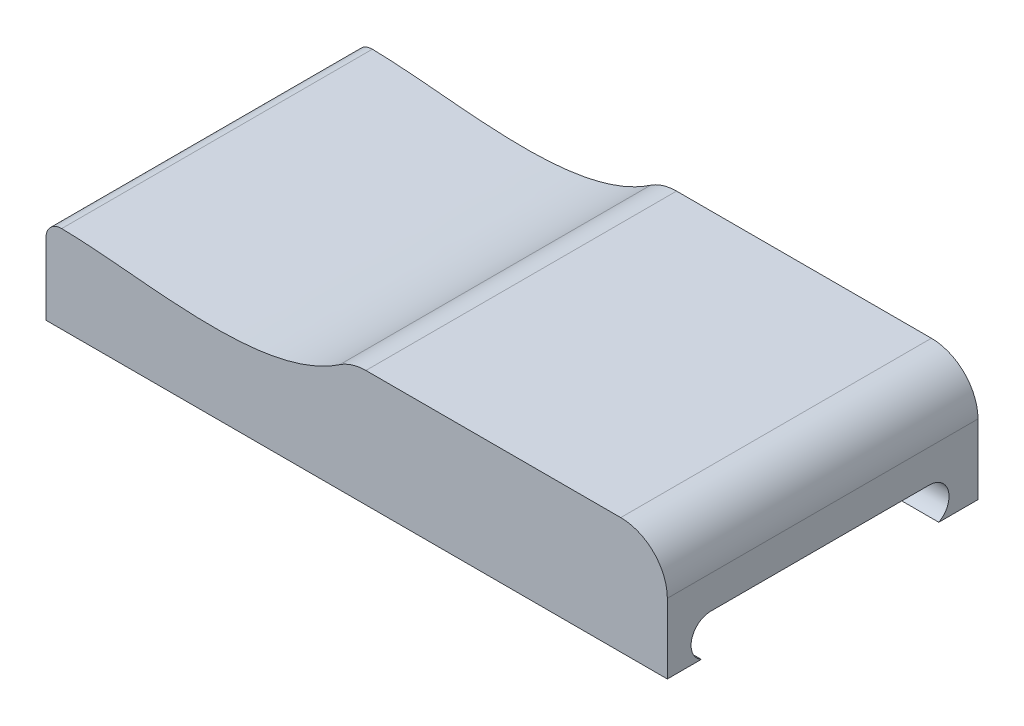
ISO-10303-21;
HEADER;
FILE_DESCRIPTION(('STEP AP214'),'2;1');
FILE_NAME('part.step','',(''),(''),'','','');
FILE_SCHEMA(('AUTOMOTIVE_DESIGN { 1 0 10303 214 1 1 1 1 }'));
ENDSEC;
DATA;
#1=APPLICATION_CONTEXT('core data for automotive mechanical design processes');
#2=APPLICATION_PROTOCOL_DEFINITION('international standard','automotive_design',2000,#1);
#3=PRODUCT_CONTEXT('',#1,'mechanical');
#4=PRODUCT('Part','Part','',(#3));
#5=PRODUCT_RELATED_PRODUCT_CATEGORY('part','',(#4));
#6=PRODUCT_DEFINITION_FORMATION('','',#4);
#7=PRODUCT_DEFINITION_CONTEXT('part definition',#1,'design');
#8=PRODUCT_DEFINITION('design','',#6,#7);
#9=PRODUCT_DEFINITION_SHAPE('','',#8);
#10=(LENGTH_UNIT() NAMED_UNIT(*) SI_UNIT(.MILLI.,.METRE.));
#11=(NAMED_UNIT(*) PLANE_ANGLE_UNIT() SI_UNIT($,.RADIAN.));
#12=(NAMED_UNIT(*) SI_UNIT($,.STERADIAN.) SOLID_ANGLE_UNIT());
#13=UNCERTAINTY_MEASURE_WITH_UNIT(LENGTH_MEASURE(1.E-05),#10,'distance_accuracy_value','');
#14=(GEOMETRIC_REPRESENTATION_CONTEXT(3) GLOBAL_UNCERTAINTY_ASSIGNED_CONTEXT((#13)) GLOBAL_UNIT_ASSIGNED_CONTEXT((#10,
#11,#12)) REPRESENTATION_CONTEXT('',''));
#15=CARTESIAN_POINT('',(0.,0.,0.));
#16=DIRECTION('',(0.,0.,1.));
#17=DIRECTION('',(1.,0.,0.));
#18=AXIS2_PLACEMENT_3D('',#15,#16,#17);
#19=CARTESIAN_POINT('',(-200.,60.,100.));
#20=DIRECTION('',(-1.,0.,0.));
#21=DIRECTION('',(0.,0.,1.));
#22=AXIS2_PLACEMENT_3D('',#19,#20,#21);
#23=PLANE('',#22);
#24=CARTESIAN_POINT('',(-200.,-3.87011120885277,-68.6456549981143));
#25=DIRECTION('',(-1.,0.,0.));
#26=DIRECTION('',(0.,0.,1.));
#27=AXIS2_PLACEMENT_3D('',#24,#25,#26);
#28=CIRCLE('',#27,12.7);
#29=CARTESIAN_POINT('',(-200.,8.82988879114723,-68.6456549981143));
#30=VERTEX_POINT('',#29);
#31=CARTESIAN_POINT('',(-200.,-15.,-74.7624822391516));
#32=VERTEX_POINT('',#31);
#33=EDGE_CURVE('E144',#30,#32,#28,.T.);
#34=ORIENTED_EDGE('',*,*,#33,.F.);
#35=DIRECTION('',(0.,0.,1.));
#36=VECTOR('',#35,1.);
#37=CARTESIAN_POINT('',(-200.,8.82988879114722,0.));
#38=LINE('',#37,#36);
#39=CARTESIAN_POINT('',(-200.,8.82988879114722,71.9943450018857));
#40=VERTEX_POINT('',#39);
#41=EDGE_CURVE('E146',#30,#40,#38,.T.);
#42=ORIENTED_EDGE('',*,*,#41,.T.);
#43=CARTESIAN_POINT('',(-200.,-3.87011120885278,71.9943450018857));
#44=DIRECTION('',(-1.,0.,0.));
#45=DIRECTION('',(0.,0.,1.));
#46=AXIS2_PLACEMENT_3D('',#43,#44,#45);
#47=CIRCLE('',#46,12.7);
#48=CARTESIAN_POINT('',(-200.,-15.,78.1111722429229));
#49=VERTEX_POINT('',#48);
#50=EDGE_CURVE('E136',#40,#49,#47,.F.);
#51=ORIENTED_EDGE('',*,*,#50,.T.);
#52=DIRECTION('',(0.,0.,-1.));
#53=VECTOR('',#52,1.);
#54=CARTESIAN_POINT('',(-200.,-15.,100.));
#55=LINE('',#54,#53);
#56=CARTESIAN_POINT('',(-200.,-15.,100.));
#57=VERTEX_POINT('',#56);
#58=EDGE_CURVE('E161',#57,#49,#55,.T.);
#59=ORIENTED_EDGE('',*,*,#58,.F.);
#60=DIRECTION('',(0.,-1.,0.));
#61=VECTOR('',#60,1.);
#62=CARTESIAN_POINT('',(-200.,60.,100.));
#63=LINE('',#62,#61);
#64=CARTESIAN_POINT('',(-200.,31.1944479439063,100.));
#65=VERTEX_POINT('',#64);
#66=EDGE_CURVE('E248',#65,#57,#63,.T.);
#67=ORIENTED_EDGE('',*,*,#66,.F.);
#68=DIRECTION('',(0.,0.,-1.));
#69=VECTOR('',#68,1.);
#70=CARTESIAN_POINT('',(-200.,31.1944479439063,-100.));
#71=LINE('',#70,#69);
#72=CARTESIAN_POINT('',(-200.,31.1944479439063,-100.));
#73=VERTEX_POINT('',#72);
#74=EDGE_CURVE('E42',#65,#73,#71,.T.);
#75=ORIENTED_EDGE('',*,*,#74,.T.);
#76=DIRECTION('',(0.,-1.,0.));
#77=VECTOR('',#76,1.);
#78=CARTESIAN_POINT('',(-200.,60.,-100.));
#79=LINE('',#78,#77);
#80=CARTESIAN_POINT('',(-200.,-15.,-100.));
#81=VERTEX_POINT('',#80);
#82=EDGE_CURVE('E258',#73,#81,#79,.T.);
#83=ORIENTED_EDGE('',*,*,#82,.T.);
#84=EDGE_CURVE('E160',#32,#81,#55,.T.);
#85=ORIENTED_EDGE('',*,*,#84,.F.);
#86=EDGE_LOOP('',(#34,#42,#51,#59,#67,#75,#83,#85));
#87=FACE_BOUND('',#86,.T.);
#88=ADVANCED_FACE('F34',(#87),#23,.T.);
#89=CARTESIAN_POINT('',(200.,60.,100.));
#90=DIRECTION('',(-1.,0.,0.));
#91=DIRECTION('',(0.,0.,1.));
#92=AXIS2_PLACEMENT_3D('',#89,#90,#91);
#93=PLANE('',#92);
#94=DIRECTION('',(0.,0.,1.));
#95=VECTOR('',#94,1.);
#96=CARTESIAN_POINT('',(200.,8.82988879114722,0.));
#97=LINE('',#96,#95);
#98=CARTESIAN_POINT('',(200.,8.82988879114723,-68.6456549981143));
#99=VERTEX_POINT('',#98);
#100=CARTESIAN_POINT('',(200.,8.82988879114722,71.9943450018857));
#101=VERTEX_POINT('',#100);
#102=EDGE_CURVE('E123',#99,#101,#97,.T.);
#103=ORIENTED_EDGE('',*,*,#102,.F.);
#104=CARTESIAN_POINT('',(200.,-3.87011120885277,-68.6456549981143));
#105=DIRECTION('',(-1.,0.,0.));
#106=DIRECTION('',(0.,0.,1.));
#107=AXIS2_PLACEMENT_3D('',#104,#105,#106);
#108=CIRCLE('',#107,12.7);
#109=CARTESIAN_POINT('',(200.,-15.,-74.7624822391516));
#110=VERTEX_POINT('',#109);
#111=EDGE_CURVE('E132',#99,#110,#108,.T.);
#112=ORIENTED_EDGE('',*,*,#111,.T.);
#113=DIRECTION('',(0.,0.,1.));
#114=VECTOR('',#113,1.);
#115=CARTESIAN_POINT('',(200.,-15.,-100.));
#116=LINE('',#115,#114);
#117=CARTESIAN_POINT('',(200.,-15.,-100.));
#118=VERTEX_POINT('',#117);
#119=EDGE_CURVE('E167',#118,#110,#116,.T.);
#120=ORIENTED_EDGE('',*,*,#119,.F.);
#121=DIRECTION('',(0.,-1.,0.));
#122=VECTOR('',#121,1.);
#123=CARTESIAN_POINT('',(200.,60.,-100.));
#124=LINE('',#123,#122);
#125=CARTESIAN_POINT('',(200.,30.,-100.));
#126=VERTEX_POINT('',#125);
#127=EDGE_CURVE('E271',#126,#118,#124,.T.);
#128=ORIENTED_EDGE('',*,*,#127,.F.);
#129=DIRECTION('',(0.,0.,-1.));
#130=VECTOR('',#129,1.);
#131=CARTESIAN_POINT('',(200.,30.,100.));
#132=LINE('',#131,#130);
#133=CARTESIAN_POINT('',(200.,30.,100.));
#134=VERTEX_POINT('',#133);
#135=EDGE_CURVE('E229',#126,#134,#132,.F.);
#136=ORIENTED_EDGE('',*,*,#135,.T.);
#137=DIRECTION('',(0.,-1.,0.));
#138=VECTOR('',#137,1.);
#139=CARTESIAN_POINT('',(200.,60.,100.));
#140=LINE('',#139,#138);
#141=CARTESIAN_POINT('',(200.,-15.,100.));
#142=VERTEX_POINT('',#141);
#143=EDGE_CURVE('E252',#134,#142,#140,.T.);
#144=ORIENTED_EDGE('',*,*,#143,.T.);
#145=CARTESIAN_POINT('',(200.,-15.,78.111172242923));
#146=VERTEX_POINT('',#145);
#147=EDGE_CURVE('E143',#146,#142,#116,.T.);
#148=ORIENTED_EDGE('',*,*,#147,.F.);
#149=CARTESIAN_POINT('',(200.,-3.87011120885278,71.9943450018857));
#150=DIRECTION('',(-1.,0.,0.));
#151=DIRECTION('',(0.,0.,1.));
#152=AXIS2_PLACEMENT_3D('',#149,#150,#151);
#153=CIRCLE('',#152,12.7);
#154=EDGE_CURVE('E49',#101,#146,#153,.F.);
#155=ORIENTED_EDGE('',*,*,#154,.F.);
#156=EDGE_LOOP('',(#103,#112,#120,#128,#136,#144,#148,#155));
#157=FACE_BOUND('',#156,.T.);
#158=ADVANCED_FACE('F141',(#157),#93,.F.);
#159=CARTESIAN_POINT('',(0.,-15.,0.));
#160=DIRECTION('',(0.,-1.,0.));
#161=DIRECTION('',(0.,0.,-1.));
#162=AXIS2_PLACEMENT_3D('',#159,#160,#161);
#163=PLANE('',#162);
#164=ORIENTED_EDGE('',*,*,#58,.T.);
#165=DIRECTION('',(-1.,0.,0.));
#166=VECTOR('',#165,1.);
#167=CARTESIAN_POINT('',(200.,-15.,78.1111722429229));
#168=LINE('',#167,#166);
#169=EDGE_CURVE('E138',#146,#49,#168,.T.);
#170=ORIENTED_EDGE('',*,*,#169,.F.);
#171=ORIENTED_EDGE('',*,*,#147,.T.);
#172=DIRECTION('',(-1.,0.,0.));
#173=VECTOR('',#172,1.);
#174=CARTESIAN_POINT('',(200.,-15.,100.));
#175=LINE('',#174,#173);
#176=EDGE_CURVE('E155',#142,#57,#175,.T.);
#177=ORIENTED_EDGE('',*,*,#176,.T.);
#178=EDGE_LOOP('',(#164,#170,#171,#177));
#179=FACE_BOUND('',#178,.T.);
#180=ADVANCED_FACE('F198',(#179),#163,.T.);
#181=CARTESIAN_POINT('',(-200.,60.,100.));
#182=DIRECTION('',(0.,0.,-1.));
#183=DIRECTION('',(-1.,0.,0.));
#184=AXIS2_PLACEMENT_3D('',#181,#182,#183);
#185=PLANE('',#184);
#186=CARTESIAN_POINT('',(-200.,41.0332841643842,100.));
#187=CARTESIAN_POINT('',(-145.162329497686,43.5654388195843,100.));
#188=CARTESIAN_POINT('',(-56.8269781144573,16.6614674130772,100.));
#189=CARTESIAN_POINT('',(-3.94704073671054,60.,100.));
#190=B_SPLINE_CURVE_WITH_KNOTS('',3,(#186,#187,#188,#189),.UNSPECIFIED.,.F.,.F.,(4,4),(0.,1.),.UNSPECIFIED.);
#191=CARTESIAN_POINT('',(-189.89568038354,41.1939037999827,100.));
#192=VERTEX_POINT('',#191);
#193=CARTESIAN_POINT('',(-10.8333811509343,54.8760659515193,100.));
#194=VERTEX_POINT('',#193);
#195=EDGE_CURVE('E170',#192,#194,#190,.T.);
#196=ORIENTED_EDGE('',*,*,#195,.F.);
#197=CARTESIAN_POINT('',(-190.,31.1944479439063,100.));
#198=DIRECTION('',(0.,0.,-1.));
#199=DIRECTION('',(-1.,0.,0.));
#200=AXIS2_PLACEMENT_3D('',#197,#198,#199);
#201=CIRCLE('',#200,10.);
#202=EDGE_CURVE('E245',#192,#65,#201,.F.);
#203=ORIENTED_EDGE('',*,*,#202,.T.);
#204=ORIENTED_EDGE('',*,*,#66,.T.);
#205=ORIENTED_EDGE('',*,*,#176,.F.);
#206=ORIENTED_EDGE('',*,*,#143,.F.);
#207=CARTESIAN_POINT('',(170.,30.,100.));
#208=DIRECTION('',(0.,0.,-1.));
#209=DIRECTION('',(-1.,0.,0.));
#210=AXIS2_PLACEMENT_3D('',#207,#208,#209);
#211=CIRCLE('',#210,30.);
#212=CARTESIAN_POINT('',(170.,60.,100.));
#213=VERTEX_POINT('',#212);
#214=EDGE_CURVE('E239',#134,#213,#211,.F.);
#215=ORIENTED_EDGE('',*,*,#214,.T.);
#216=DIRECTION('',(1.,0.,0.));
#217=VECTOR('',#216,1.);
#218=CARTESIAN_POINT('',(-200.,60.,100.));
#219=LINE('',#218,#217);
#220=CARTESIAN_POINT('',(5.935081592432,60.,100.));
#221=VERTEX_POINT('',#220);
#222=EDGE_CURVE('E260',#221,#213,#219,.T.);
#223=ORIENTED_EDGE('',*,*,#222,.F.);
#224=CARTESIAN_POINT('',(5.93508159243199,30.,100.));
#225=DIRECTION('',(0.,0.,-1.));
#226=DIRECTION('',(-1.,0.,0.));
#227=AXIS2_PLACEMENT_3D('',#224,#225,#226);
#228=CIRCLE('',#227,30.);
#229=EDGE_CURVE('E236',#221,#194,#228,.F.);
#230=ORIENTED_EDGE('',*,*,#229,.T.);
#231=EDGE_LOOP('',(#196,#203,#204,#205,#206,#215,#223,#230));
#232=FACE_BOUND('',#231,.T.);
#233=ADVANCED_FACE('F195',(#232),#185,.F.);
#234=CARTESIAN_POINT('',(-200.,60.,-100.));
#235=DIRECTION('',(0.,0.,-1.));
#236=DIRECTION('',(-1.,0.,0.));
#237=AXIS2_PLACEMENT_3D('',#234,#235,#236);
#238=PLANE('',#237);
#239=ORIENTED_EDGE('',*,*,#82,.F.);
#240=CARTESIAN_POINT('',(-190.,31.1944479439063,-100.));
#241=DIRECTION('',(0.,0.,-1.));
#242=DIRECTION('',(-1.,0.,0.));
#243=AXIS2_PLACEMENT_3D('',#240,#241,#242);
#244=CIRCLE('',#243,10.);
#245=CARTESIAN_POINT('',(-189.89568038354,41.1939037999827,-100.));
#246=VERTEX_POINT('',#245);
#247=EDGE_CURVE('E11',#73,#246,#244,.T.);
#248=ORIENTED_EDGE('',*,*,#247,.T.);
#249=CARTESIAN_POINT('',(-200.,41.0332841643842,-100.));
#250=CARTESIAN_POINT('',(-145.162329497686,43.5654388195843,-100.));
#251=CARTESIAN_POINT('',(-56.8269781144573,16.6614674130772,-100.));
#252=CARTESIAN_POINT('',(-3.94704073671054,60.,-100.));
#253=B_SPLINE_CURVE_WITH_KNOTS('',3,(#249,#250,#251,#252),.UNSPECIFIED.,.F.,.F.,(4,4),(0.,1.),.UNSPECIFIED.);
#254=CARTESIAN_POINT('',(-10.8333811509343,54.8760659515193,-100.));
#255=VERTEX_POINT('',#254);
#256=EDGE_CURVE('E256',#255,#246,#253,.F.);
#257=ORIENTED_EDGE('',*,*,#256,.F.);
#258=CARTESIAN_POINT('',(5.93508159243199,30.,-100.));
#259=DIRECTION('',(0.,0.,-1.));
#260=DIRECTION('',(-1.,0.,0.));
#261=AXIS2_PLACEMENT_3D('',#258,#259,#260);
#262=CIRCLE('',#261,30.);
#263=CARTESIAN_POINT('',(5.935081592432,60.,-100.));
#264=VERTEX_POINT('',#263);
#265=EDGE_CURVE('E219',#255,#264,#262,.T.);
#266=ORIENTED_EDGE('',*,*,#265,.T.);
#267=DIRECTION('',(1.,0.,0.));
#268=VECTOR('',#267,1.);
#269=CARTESIAN_POINT('',(-200.,60.,-100.));
#270=LINE('',#269,#268);
#271=CARTESIAN_POINT('',(170.,60.,-100.));
#272=VERTEX_POINT('',#271);
#273=EDGE_CURVE('E259',#264,#272,#270,.T.);
#274=ORIENTED_EDGE('',*,*,#273,.T.);
#275=CARTESIAN_POINT('',(170.,30.,-100.));
#276=DIRECTION('',(0.,0.,-1.));
#277=DIRECTION('',(-1.,0.,0.));
#278=AXIS2_PLACEMENT_3D('',#275,#276,#277);
#279=CIRCLE('',#278,30.);
#280=EDGE_CURVE('E226',#272,#126,#279,.T.);
#281=ORIENTED_EDGE('',*,*,#280,.T.);
#282=ORIENTED_EDGE('',*,*,#127,.T.);
#283=DIRECTION('',(1.,0.,0.));
#284=VECTOR('',#283,1.);
#285=CARTESIAN_POINT('',(-200.,-15.,-100.));
#286=LINE('',#285,#284);
#287=EDGE_CURVE('E164',#81,#118,#286,.T.);
#288=ORIENTED_EDGE('',*,*,#287,.F.);
#289=EDGE_LOOP('',(#239,#248,#257,#266,#274,#281,#282,#288));
#290=FACE_BOUND('',#289,.T.);
#291=ADVANCED_FACE('F193',(#290),#238,.T.);
#292=CARTESIAN_POINT('',(0.,60.,0.));
#293=DIRECTION('',(0.,-1.,0.));
#294=DIRECTION('',(0.,0.,-1.));
#295=AXIS2_PLACEMENT_3D('',#292,#293,#294);
#296=PLANE('',#295);
#297=ORIENTED_EDGE('',*,*,#222,.T.);
#298=DIRECTION('',(0.,0.,-1.));
#299=VECTOR('',#298,1.);
#300=CARTESIAN_POINT('',(170.,60.,0.));
#301=LINE('',#300,#299);
#302=EDGE_CURVE('E227',#213,#272,#301,.T.);
#303=ORIENTED_EDGE('',*,*,#302,.T.);
#304=ORIENTED_EDGE('',*,*,#273,.F.);
#305=DIRECTION('',(0.,0.,1.));
#306=VECTOR('',#305,1.);
#307=CARTESIAN_POINT('',(5.93508159243199,60.,0.));
#308=LINE('',#307,#306);
#309=EDGE_CURVE('E222',#264,#221,#308,.T.);
#310=ORIENTED_EDGE('',*,*,#309,.T.);
#311=EDGE_LOOP('',(#297,#303,#304,#310));
#312=FACE_BOUND('',#311,.T.);
#313=ADVANCED_FACE('F187',(#312),#296,.F.);
#314=CARTESIAN_POINT('',(-200.,41.0332841643842,-120.));
#315=CARTESIAN_POINT('',(-145.162329497686,43.5654388195843,-120.));
#316=CARTESIAN_POINT('',(-56.8269781144573,16.6614674130772,-120.));
#317=CARTESIAN_POINT('',(-3.94704073671054,60.,-120.));
#318=B_SPLINE_CURVE_WITH_KNOTS('',3,(#314,#315,#316,#317),.UNSPECIFIED.,.F.,.F.,(4,4),(0.,1.),.UNSPECIFIED.);
#319=DIRECTION('',(0.,0.,1.));
#320=VECTOR('',#319,1.);
#321=SURFACE_OF_LINEAR_EXTRUSION('',#318,#320);
#322=ORIENTED_EDGE('',*,*,#256,.T.);
#323=DIRECTION('',(0.,0.,1.));
#324=VECTOR('',#323,1.);
#325=CARTESIAN_POINT('',(-189.89568038354,41.1939037999827,-100.));
#326=LINE('',#325,#324);
#327=EDGE_CURVE('E242',#246,#192,#326,.T.);
#328=ORIENTED_EDGE('',*,*,#327,.T.);
#329=ORIENTED_EDGE('',*,*,#195,.T.);
#330=DIRECTION('',(0.,0.,1.));
#331=VECTOR('',#330,1.);
#332=CARTESIAN_POINT('',(-10.8333811509343,54.8760659515193,100.));
#333=LINE('',#332,#331);
#334=EDGE_CURVE('E220',#194,#255,#333,.F.);
#335=ORIENTED_EDGE('',*,*,#334,.T.);
#336=EDGE_LOOP('',(#322,#328,#329,#335));
#337=FACE_BOUND('',#336,.T.);
#338=ADVANCED_FACE('F182',(#337),#321,.F.);
#339=CARTESIAN_POINT('',(170.,30.,0.));
#340=DIRECTION('',(0.,0.,-1.));
#341=DIRECTION('',(-1.,0.,0.));
#342=AXIS2_PLACEMENT_3D('',#339,#340,#341);
#343=CYLINDRICAL_SURFACE('',#342,30.);
#344=ORIENTED_EDGE('',*,*,#214,.F.);
#345=ORIENTED_EDGE('',*,*,#135,.F.);
#346=ORIENTED_EDGE('',*,*,#280,.F.);
#347=ORIENTED_EDGE('',*,*,#302,.F.);
#348=EDGE_LOOP('',(#344,#345,#346,#347));
#349=FACE_BOUND('',#348,.T.);
#350=ADVANCED_FACE('F186',(#349),#343,.T.);
#351=CARTESIAN_POINT('',(5.93508159243199,30.,0.));
#352=DIRECTION('',(0.,0.,1.));
#353=DIRECTION('',(1.,0.,0.));
#354=AXIS2_PLACEMENT_3D('',#351,#352,#353);
#355=CYLINDRICAL_SURFACE('',#354,30.);
#356=ORIENTED_EDGE('',*,*,#265,.F.);
#357=ORIENTED_EDGE('',*,*,#334,.F.);
#358=ORIENTED_EDGE('',*,*,#229,.F.);
#359=ORIENTED_EDGE('',*,*,#309,.F.);
#360=EDGE_LOOP('',(#356,#357,#358,#359));
#361=FACE_BOUND('',#360,.T.);
#362=ADVANCED_FACE('F208',(#361),#355,.T.);
#363=CARTESIAN_POINT('',(-190.,31.1944479439063,0.));
#364=DIRECTION('',(0.,0.,1.));
#365=DIRECTION('',(1.,0.,0.));
#366=AXIS2_PLACEMENT_3D('',#363,#364,#365);
#367=CYLINDRICAL_SURFACE('',#366,10.);
#368=ORIENTED_EDGE('',*,*,#247,.F.);
#369=ORIENTED_EDGE('',*,*,#74,.F.);
#370=ORIENTED_EDGE('',*,*,#202,.F.);
#371=ORIENTED_EDGE('',*,*,#327,.F.);
#372=EDGE_LOOP('',(#368,#369,#370,#371));
#373=FACE_BOUND('',#372,.T.);
#374=ADVANCED_FACE('F36',(#373),#367,.T.);
#375=DIRECTION('',(-1.,0.,0.));
#376=VECTOR('',#375,1.);
#377=CARTESIAN_POINT('',(200.,-15.,-74.7624822391516));
#378=LINE('',#377,#376);
#379=EDGE_CURVE('E152',#110,#32,#378,.T.);
#380=ORIENTED_EDGE('',*,*,#379,.T.);
#381=ORIENTED_EDGE('',*,*,#84,.T.);
#382=ORIENTED_EDGE('',*,*,#287,.T.);
#383=ORIENTED_EDGE('',*,*,#119,.T.);
#384=EDGE_LOOP('',(#380,#381,#382,#383));
#385=FACE_BOUND('',#384,.T.);
#386=ADVANCED_FACE('F189',(#385),#163,.T.);
#387=CARTESIAN_POINT('',(200.,-3.87011120885277,-68.6456549981143));
#388=DIRECTION('',(-1.,0.,0.));
#389=DIRECTION('',(0.,0.,1.));
#390=AXIS2_PLACEMENT_3D('',#387,#388,#389);
#391=CYLINDRICAL_SURFACE('',#390,12.7);
#392=ORIENTED_EDGE('',*,*,#33,.T.);
#393=ORIENTED_EDGE('',*,*,#379,.F.);
#394=ORIENTED_EDGE('',*,*,#111,.F.);
#395=DIRECTION('',(-1.,0.,0.));
#396=VECTOR('',#395,1.);
#397=CARTESIAN_POINT('',(200.,8.82988879114723,-68.6456549981143));
#398=LINE('',#397,#396);
#399=EDGE_CURVE('E128',#99,#30,#398,.T.);
#400=ORIENTED_EDGE('',*,*,#399,.T.);
#401=EDGE_LOOP('',(#392,#393,#394,#400));
#402=FACE_BOUND('',#401,.T.);
#403=ADVANCED_FACE('F283',(#402),#391,.F.);
#404=CARTESIAN_POINT('',(200.,8.82988879114722,0.));
#405=DIRECTION('',(0.,-1.,0.));
#406=DIRECTION('',(0.,0.,-1.));
#407=AXIS2_PLACEMENT_3D('',#404,#405,#406);
#408=PLANE('',#407);
#409=ORIENTED_EDGE('',*,*,#41,.F.);
#410=ORIENTED_EDGE('',*,*,#399,.F.);
#411=ORIENTED_EDGE('',*,*,#102,.T.);
#412=DIRECTION('',(-1.,0.,0.));
#413=VECTOR('',#412,1.);
#414=CARTESIAN_POINT('',(200.,8.82988879114722,71.9943450018857));
#415=LINE('',#414,#413);
#416=EDGE_CURVE('E126',#101,#40,#415,.T.);
#417=ORIENTED_EDGE('',*,*,#416,.T.);
#418=EDGE_LOOP('',(#409,#410,#411,#417));
#419=FACE_BOUND('',#418,.T.);
#420=ADVANCED_FACE('F125',(#419),#408,.T.);
#421=CARTESIAN_POINT('',(200.,-3.87011120885278,71.9943450018857));
#422=DIRECTION('',(-1.,0.,0.));
#423=DIRECTION('',(0.,0.,1.));
#424=AXIS2_PLACEMENT_3D('',#421,#422,#423);
#425=CYLINDRICAL_SURFACE('',#424,12.7);
#426=ORIENTED_EDGE('',*,*,#50,.F.);
#427=ORIENTED_EDGE('',*,*,#416,.F.);
#428=ORIENTED_EDGE('',*,*,#154,.T.);
#429=ORIENTED_EDGE('',*,*,#169,.T.);
#430=EDGE_LOOP('',(#426,#427,#428,#429));
#431=FACE_BOUND('',#430,.T.);
#432=ADVANCED_FACE('F134',(#431),#425,.F.);
#433=CLOSED_SHELL('',(#88,#158,#180,#233,#291,#313,#338,#350,#362,#374,#386,#403,#420,#432));
#434=MANIFOLD_SOLID_BREP('B2',#433);
#435=ADVANCED_BREP_SHAPE_REPRESENTATION('',(#18,#434),#14);
#436=SHAPE_DEFINITION_REPRESENTATION(#9,#435);
ENDSEC;
END-ISO-10303-21;
